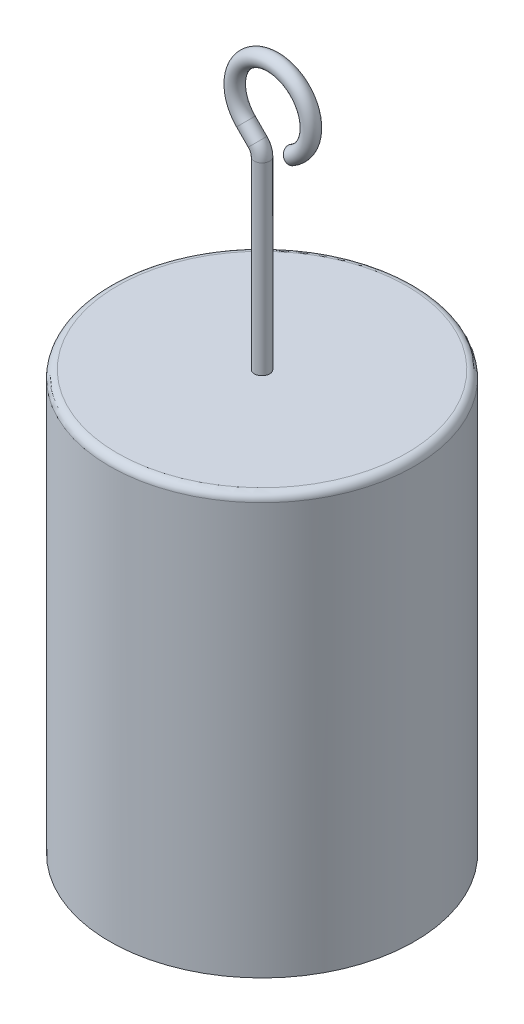
ISO-10303-21;
HEADER;
FILE_DESCRIPTION(('STEP AP214'),'2;1');
FILE_NAME('part.step','',(''),(''),'','','');
FILE_SCHEMA(('AUTOMOTIVE_DESIGN { 1 0 10303 214 1 1 1 1 }'));
ENDSEC;
DATA;
#1=APPLICATION_CONTEXT('core data for automotive mechanical design processes');
#2=APPLICATION_PROTOCOL_DEFINITION('international standard','automotive_design',2000,#1);
#3=PRODUCT_CONTEXT('',#1,'mechanical');
#4=PRODUCT('Part','Part','',(#3));
#5=PRODUCT_RELATED_PRODUCT_CATEGORY('part','',(#4));
#6=PRODUCT_DEFINITION_FORMATION('','',#4);
#7=PRODUCT_DEFINITION_CONTEXT('part definition',#1,'design');
#8=PRODUCT_DEFINITION('design','',#6,#7);
#9=PRODUCT_DEFINITION_SHAPE('','',#8);
#10=(LENGTH_UNIT() NAMED_UNIT(*) SI_UNIT(.MILLI.,.METRE.));
#11=(NAMED_UNIT(*) PLANE_ANGLE_UNIT() SI_UNIT($,.RADIAN.));
#12=(NAMED_UNIT(*) SI_UNIT($,.STERADIAN.) SOLID_ANGLE_UNIT());
#13=UNCERTAINTY_MEASURE_WITH_UNIT(LENGTH_MEASURE(1.E-05),#10,'distance_accuracy_value','');
#14=(GEOMETRIC_REPRESENTATION_CONTEXT(3) GLOBAL_UNCERTAINTY_ASSIGNED_CONTEXT((#13)) GLOBAL_UNIT_ASSIGNED_CONTEXT((#10,
#11,#12)) REPRESENTATION_CONTEXT('',''));
#15=CARTESIAN_POINT('',(0.,0.,0.));
#16=DIRECTION('',(0.,0.,1.));
#17=DIRECTION('',(1.,0.,0.));
#18=AXIS2_PLACEMENT_3D('',#15,#16,#17);
#19=CARTESIAN_POINT('',(0.,27.5,0.));
#20=DIRECTION('',(0.,1.,0.));
#21=DIRECTION('',(0.,0.,1.));
#22=AXIS2_PLACEMENT_3D('',#19,#20,#21);
#23=PLANE('',#22);
#24=CARTESIAN_POINT('',(0.,27.5,0.));
#25=DIRECTION('',(0.,-1.,0.));
#26=DIRECTION('',(1.,0.,0.));
#27=AXIS2_PLACEMENT_3D('',#24,#25,#26);
#28=CIRCLE('',#27,1.);
#29=CARTESIAN_POINT('',(1.00000000000003,27.5,0.));
#30=VERTEX_POINT('',#29);
#31=EDGE_CURVE('E77',#30,#30,#28,.T.);
#32=ORIENTED_EDGE('',*,*,#31,.T.);
#33=EDGE_LOOP('',(#32));
#34=FACE_BOUND('',#33,.T.);
#35=CARTESIAN_POINT('',(0.,27.5,0.));
#36=DIRECTION('',(0.,1.,0.));
#37=DIRECTION('',(0.,0.,1.));
#38=AXIS2_PLACEMENT_3D('',#35,#36,#37);
#39=CIRCLE('',#38,19.);
#40=CARTESIAN_POINT('',(0.,27.5,19.));
#41=VERTEX_POINT('',#40);
#42=EDGE_CURVE('E11',#41,#41,#39,.T.);
#43=ORIENTED_EDGE('',*,*,#42,.T.);
#44=EDGE_LOOP('',(#43));
#45=FACE_BOUND('',#44,.T.);
#46=ADVANCED_FACE('F48',(#34,#45),#23,.T.);
#47=CARTESIAN_POINT('',(0.,-27.027027027027,0.));
#48=DIRECTION('',(0.,-1.,0.));
#49=DIRECTION('',(0.,0.,-1.));
#50=AXIS2_PLACEMENT_3D('',#47,#48,#49);
#51=CYLINDRICAL_SURFACE('',#50,20.);
#52=CARTESIAN_POINT('',(0.,26.5,0.));
#53=DIRECTION('',(0.,1.,0.));
#54=DIRECTION('',(0.,0.,1.));
#55=AXIS2_PLACEMENT_3D('',#52,#53,#54);
#56=CIRCLE('',#55,20.);
#57=CARTESIAN_POINT('',(0.,26.5,20.));
#58=VERTEX_POINT('',#57);
#59=EDGE_CURVE('E55',#58,#58,#56,.F.);
#60=ORIENTED_EDGE('',*,*,#59,.T.);
#61=EDGE_LOOP('',(#60));
#62=FACE_BOUND('',#61,.T.);
#63=CARTESIAN_POINT('',(0.,-27.5,0.));
#64=DIRECTION('',(0.,-1.,0.));
#65=DIRECTION('',(0.,0.,-1.));
#66=AXIS2_PLACEMENT_3D('',#63,#64,#65);
#67=CIRCLE('',#66,20.);
#68=CARTESIAN_POINT('',(0.,-27.5,-20.));
#69=VERTEX_POINT('',#68);
#70=EDGE_CURVE('E59',#69,#69,#67,.T.);
#71=ORIENTED_EDGE('',*,*,#70,.F.);
#72=EDGE_LOOP('',(#71));
#73=FACE_BOUND('',#72,.T.);
#74=ADVANCED_FACE('F98',(#62,#73),#51,.T.);
#75=CARTESIAN_POINT('',(20.,-27.5,0.));
#76=DIRECTION('',(0.,-1.,0.));
#77=DIRECTION('',(0.,0.,-1.));
#78=AXIS2_PLACEMENT_3D('',#75,#76,#77);
#79=PLANE('',#78);
#80=ORIENTED_EDGE('',*,*,#70,.T.);
#81=EDGE_LOOP('',(#80));
#82=FACE_BOUND('',#81,.T.);
#83=ADVANCED_FACE('F102',(#82),#79,.T.);
#84=CARTESIAN_POINT('',(0.,26.5,0.));
#85=DIRECTION('',(0.,1.,0.));
#86=DIRECTION('',(0.,0.,1.));
#87=AXIS2_PLACEMENT_3D('',#84,#85,#86);
#88=TOROIDAL_SURFACE('',#87,19.,1.);
#89=ORIENTED_EDGE('',*,*,#42,.F.);
#90=EDGE_LOOP('',(#89));
#91=FACE_BOUND('',#90,.T.);
#92=ORIENTED_EDGE('',*,*,#59,.F.);
#93=EDGE_LOOP('',(#92));
#94=FACE_BOUND('',#93,.T.);
#95=ADVANCED_FACE('F50',(#91,#94),#88,.T.);
#96=CARTESIAN_POINT('',(3.91421356237309,53.8267272305702,0.));
#97=DIRECTION('',(0.866025403784439,0.499999999999999,0.));
#98=DIRECTION('',(-0.5,0.866025403784439,0.));
#99=AXIS2_PLACEMENT_3D('',#96,#97,#98);
#100=PLANE('',#99);
#101=CARTESIAN_POINT('',(3.91421356237309,53.8267272305702,0.));
#102=DIRECTION('',(0.866025403784439,0.499999999999999,0.));
#103=DIRECTION('',(-0.5,0.866025403784439,0.));
#104=AXIS2_PLACEMENT_3D('',#101,#102,#103);
#105=CIRCLE('',#104,1.);
#106=CARTESIAN_POINT('',(4.41421356237309,52.9607018267858,0.));
#107=VERTEX_POINT('',#106);
#108=EDGE_CURVE('E63',#107,#107,#105,.T.);
#109=ORIENTED_EDGE('',*,*,#108,.F.);
#110=EDGE_LOOP('',(#109));
#111=FACE_BOUND('',#110,.T.);
#112=ADVANCED_FACE('F85',(#111),#100,.F.);
#113=CARTESIAN_POINT('',(0.,27.5,0.));
#114=DIRECTION('',(0.,1.,0.));
#115=DIRECTION('',(0.,0.,1.));
#116=AXIS2_PLACEMENT_3D('',#113,#114,#115);
#117=CYLINDRICAL_SURFACE('',#116,1.);
#118=CARTESIAN_POINT('',(0.,51.6715728752538,0.));
#119=DIRECTION('',(0.,-1.,0.));
#120=DIRECTION('',(1.,0.,0.));
#121=AXIS2_PLACEMENT_3D('',#118,#119,#120);
#122=CIRCLE('',#121,1.);
#123=CARTESIAN_POINT('',(1.00000000000003,51.6715728752538,0.));
#124=VERTEX_POINT('',#123);
#125=EDGE_CURVE('E74',#124,#124,#122,.T.);
#126=ORIENTED_EDGE('',*,*,#125,.T.);
#127=EDGE_LOOP('',(#126));
#128=FACE_BOUND('',#127,.T.);
#129=ORIENTED_EDGE('',*,*,#31,.F.);
#130=EDGE_LOOP('',(#129));
#131=FACE_BOUND('',#130,.T.);
#132=ADVANCED_FACE('F82',(#128,#131),#117,.T.);
#133=CARTESIAN_POINT('',(-2.,51.6715728752538,0.));
#134=DIRECTION('',(0.,0.,1.));
#135=DIRECTION('',(1.,0.,0.));
#136=AXIS2_PLACEMENT_3D('',#133,#134,#135);
#137=TOROIDAL_SURFACE('',#136,2.00000000000003,1.);
#138=CARTESIAN_POINT('',(-0.58578643762687,53.0857864376269,0.));
#139=DIRECTION('',(0.707106781186548,-0.707106781186547,0.));
#140=DIRECTION('',(0.707106781186547,0.707106781186548,0.));
#141=AXIS2_PLACEMENT_3D('',#138,#139,#140);
#142=CIRCLE('',#141,1.);
#143=CARTESIAN_POINT('',(0.121320343559687,53.7928932188135,0.));
#144=VERTEX_POINT('',#143);
#145=EDGE_CURVE('E71',#144,#144,#142,.T.);
#146=CARTESIAN_POINT('',(-2.,51.6715728752538,0.));
#147=DIRECTION('',(0.,0.,1.));
#148=DIRECTION('',(1.,0.,0.));
#149=AXIS2_PLACEMENT_3D('',#146,#147,#148);
#150=CIRCLE('',#149,3.00000000000003);
#151=EDGE_CURVE('',#124,#144,#150,.T.);
#152=ORIENTED_EDGE('',*,*,#125,.F.);
#153=ORIENTED_EDGE('',*,*,#145,.T.);
#154=ORIENTED_EDGE('',*,*,#151,.T.);
#155=ORIENTED_EDGE('',*,*,#151,.F.);
#156=EDGE_LOOP('',(#152,#154,#153,#155));
#157=FACE_BOUND('',#156,.T.);
#158=ADVANCED_FACE('F84',(#157),#137,.T.);
#159=CARTESIAN_POINT('',(-0.585786437626877,53.0857864376269,0.));
#160=DIRECTION('',(-0.707106781186548,0.707106781186547,0.));
#161=DIRECTION('',(-0.707106781186547,-0.707106781186548,0.));
#162=AXIS2_PLACEMENT_3D('',#159,#160,#161);
#163=CYLINDRICAL_SURFACE('',#162,1.);
#164=CARTESIAN_POINT('',(-2.12132034355962,54.6213203435597,0.));
#165=DIRECTION('',(0.707106781186548,-0.707106781186547,0.));
#166=DIRECTION('',(0.707106781186547,0.707106781186548,0.));
#167=AXIS2_PLACEMENT_3D('',#164,#165,#166);
#168=CIRCLE('',#167,1.);
#169=CARTESIAN_POINT('',(-2.82842712474616,53.9142135623731,0.));
#170=VERTEX_POINT('',#169);
#171=EDGE_CURVE('E68',#170,#170,#168,.T.);
#172=ORIENTED_EDGE('',*,*,#171,.T.);
#173=EDGE_LOOP('',(#172));
#174=FACE_BOUND('',#173,.T.);
#175=ORIENTED_EDGE('',*,*,#145,.F.);
#176=EDGE_LOOP('',(#175));
#177=FACE_BOUND('',#176,.T.);
#178=ADVANCED_FACE('F92',(#174,#177),#163,.T.);
#179=CARTESIAN_POINT('',(1.41421356237309,58.1568542494924,0.));
#180=DIRECTION('',(0.,0.,-1.));
#181=DIRECTION('',(-1.,0.,0.));
#182=AXIS2_PLACEMENT_3D('',#179,#180,#181);
#183=TOROIDAL_SURFACE('',#182,4.99999999999997,1.);
#184=CARTESIAN_POINT('',(1.41421356237309,58.1568542494924,0.));
#185=DIRECTION('',(0.,0.,-1.));
#186=DIRECTION('',(-1.,0.,0.));
#187=AXIS2_PLACEMENT_3D('',#184,#185,#186);
#188=CIRCLE('',#187,5.99999999999997);
#189=EDGE_CURVE('',#170,#107,#188,.T.);
#190=ORIENTED_EDGE('',*,*,#171,.F.);
#191=ORIENTED_EDGE('',*,*,#108,.T.);
#192=ORIENTED_EDGE('',*,*,#189,.T.);
#193=ORIENTED_EDGE('',*,*,#189,.F.);
#194=EDGE_LOOP('',(#190,#192,#191,#193));
#195=FACE_BOUND('',#194,.T.);
#196=ADVANCED_FACE('F108',(#195),#183,.T.);
#197=CLOSED_SHELL('',(#46,#74,#83,#95,#112,#132,#158,#178,#196));
#198=MANIFOLD_SOLID_BREP('B2',#197);
#199=ADVANCED_BREP_SHAPE_REPRESENTATION('',(#18,#198),#14);
#200=SHAPE_DEFINITION_REPRESENTATION(#9,#199);
ENDSEC;
END-ISO-10303-21;
